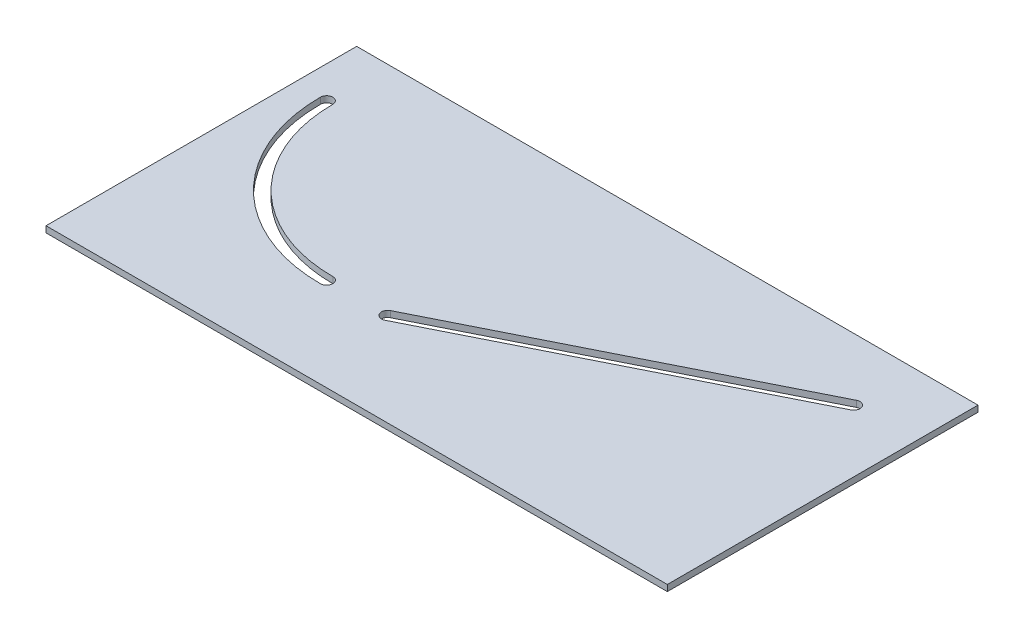
ISO-10303-21;
HEADER;
FILE_DESCRIPTION(('STEP AP214'),'2;1');
FILE_NAME('part.step','',(''),(''),'','','');
FILE_SCHEMA(('AUTOMOTIVE_DESIGN { 1 0 10303 214 1 1 1 1 }'));
ENDSEC;
DATA;
#1=APPLICATION_CONTEXT('core data for automotive mechanical design processes');
#2=APPLICATION_PROTOCOL_DEFINITION('international standard','automotive_design',2000,#1);
#3=PRODUCT_CONTEXT('',#1,'mechanical');
#4=PRODUCT('Part','Part','',(#3));
#5=PRODUCT_RELATED_PRODUCT_CATEGORY('part','',(#4));
#6=PRODUCT_DEFINITION_FORMATION('','',#4);
#7=PRODUCT_DEFINITION_CONTEXT('part definition',#1,'design');
#8=PRODUCT_DEFINITION('design','',#6,#7);
#9=PRODUCT_DEFINITION_SHAPE('','',#8);
#10=(LENGTH_UNIT() NAMED_UNIT(*) SI_UNIT(.MILLI.,.METRE.));
#11=(NAMED_UNIT(*) PLANE_ANGLE_UNIT() SI_UNIT($,.RADIAN.));
#12=(NAMED_UNIT(*) SI_UNIT($,.STERADIAN.) SOLID_ANGLE_UNIT());
#13=UNCERTAINTY_MEASURE_WITH_UNIT(LENGTH_MEASURE(1.E-05),#10,'distance_accuracy_value','');
#14=(GEOMETRIC_REPRESENTATION_CONTEXT(3) GLOBAL_UNCERTAINTY_ASSIGNED_CONTEXT((#13)) GLOBAL_UNIT_ASSIGNED_CONTEXT((#10,
#11,#12)) REPRESENTATION_CONTEXT('',''));
#15=CARTESIAN_POINT('',(0.,0.,0.));
#16=DIRECTION('',(0.,0.,1.));
#17=DIRECTION('',(1.,0.,0.));
#18=AXIS2_PLACEMENT_3D('',#15,#16,#17);
#19=CARTESIAN_POINT('',(0.,0.,1000.));
#20=DIRECTION('',(1.,0.,0.));
#21=DIRECTION('',(0.,0.,-1.));
#22=AXIS2_PLACEMENT_3D('',#19,#20,#21);
#23=PLANE('',#22);
#24=DIRECTION('',(0.,-1.,0.));
#25=VECTOR('',#24,1.);
#26=CARTESIAN_POINT('',(0.,0.,0.));
#27=LINE('',#26,#25);
#28=CARTESIAN_POINT('',(0.,20.,0.));
#29=VERTEX_POINT('',#28);
#30=CARTESIAN_POINT('',(0.,0.,0.));
#31=VERTEX_POINT('',#30);
#32=EDGE_CURVE('E183',#29,#31,#27,.T.);
#33=ORIENTED_EDGE('',*,*,#32,.T.);
#34=DIRECTION('',(0.,0.,-1.));
#35=VECTOR('',#34,1.);
#36=CARTESIAN_POINT('',(0.,0.,1000.));
#37=LINE('',#36,#35);
#38=CARTESIAN_POINT('',(0.,0.,1000.));
#39=VERTEX_POINT('',#38);
#40=EDGE_CURVE('E11',#39,#31,#37,.T.);
#41=ORIENTED_EDGE('',*,*,#40,.F.);
#42=DIRECTION('',(0.,-1.,0.));
#43=VECTOR('',#42,1.);
#44=CARTESIAN_POINT('',(0.,0.,1000.));
#45=LINE('',#44,#43);
#46=CARTESIAN_POINT('',(0.,20.,1000.));
#47=VERTEX_POINT('',#46);
#48=EDGE_CURVE('E190',#47,#39,#45,.T.);
#49=ORIENTED_EDGE('',*,*,#48,.F.);
#50=DIRECTION('',(0.,0.,-1.));
#51=VECTOR('',#50,1.);
#52=CARTESIAN_POINT('',(0.,20.,1000.));
#53=LINE('',#52,#51);
#54=EDGE_CURVE('E200',#47,#29,#53,.T.);
#55=ORIENTED_EDGE('',*,*,#54,.T.);
#56=EDGE_LOOP('',(#33,#41,#49,#55));
#57=FACE_BOUND('',#56,.T.);
#58=ADVANCED_FACE('F33',(#57),#23,.F.);
#59=CARTESIAN_POINT('',(0.,0.,1000.));
#60=DIRECTION('',(0.,1.,0.));
#61=DIRECTION('',(0.,0.,1.));
#62=AXIS2_PLACEMENT_3D('',#59,#60,#61);
#63=PLANE('',#62);
#64=CARTESIAN_POINT('',(603.245255667749,0.,200.));
#65=DIRECTION('',(0.,-1.,0.));
#66=DIRECTION('',(0.,0.,1.));
#67=AXIS2_PLACEMENT_3D('',#64,#65,#66);
#68=CIRCLE('',#67,480.);
#69=CARTESIAN_POINT('',(603.245255667747,0.,680.));
#70=VERTEX_POINT('',#69);
#71=CARTESIAN_POINT('',(123.245255667749,0.,200.));
#72=VERTEX_POINT('',#71);
#73=EDGE_CURVE('E129',#70,#72,#68,.T.);
#74=ORIENTED_EDGE('',*,*,#73,.T.);
#75=CARTESIAN_POINT('',(103.245255667749,0.,200.));
#76=DIRECTION('',(0.,1.,0.));
#77=DIRECTION('',(0.,0.,1.));
#78=AXIS2_PLACEMENT_3D('',#75,#76,#77);
#79=CIRCLE('',#78,20.);
#80=CARTESIAN_POINT('',(83.2452556677487,0.,200.));
#81=VERTEX_POINT('',#80);
#82=EDGE_CURVE('E123',#72,#81,#79,.T.);
#83=ORIENTED_EDGE('',*,*,#82,.T.);
#84=CARTESIAN_POINT('',(603.245255667749,0.,200.));
#85=DIRECTION('',(0.,1.,0.));
#86=DIRECTION('',(0.,0.,1.));
#87=AXIS2_PLACEMENT_3D('',#84,#85,#86);
#88=CIRCLE('',#87,520.);
#89=CARTESIAN_POINT('',(603.245255667749,0.,720.));
#90=VERTEX_POINT('',#89);
#91=EDGE_CURVE('E132',#81,#90,#88,.T.);
#92=ORIENTED_EDGE('',*,*,#91,.T.);
#93=CARTESIAN_POINT('',(603.245255667747,0.,700.));
#94=DIRECTION('',(0.,1.,0.));
#95=DIRECTION('',(0.,0.,1.));
#96=AXIS2_PLACEMENT_3D('',#93,#94,#95);
#97=CIRCLE('',#96,20.);
#98=EDGE_CURVE('E47',#90,#70,#97,.T.);
#99=ORIENTED_EDGE('',*,*,#98,.T.);
#100=EDGE_LOOP('',(#74,#83,#92,#99));
#101=FACE_BOUND('',#100,.T.);
#102=DIRECTION('',(0.894427190999916,0.,-0.447213595499958));
#103=VECTOR('',#102,1.);
#104=CARTESIAN_POINT('',(1808.94427191,0.,217.888543819998));
#105=LINE('',#104,#103);
#106=CARTESIAN_POINT('',(808.944271909999,0.,717.888543819998));
#107=VERTEX_POINT('',#106);
#108=CARTESIAN_POINT('',(1808.94427191,0.,217.888543819998));
#109=VERTEX_POINT('',#108);
#110=EDGE_CURVE('E168',#107,#109,#105,.T.);
#111=ORIENTED_EDGE('',*,*,#110,.T.);
#112=CARTESIAN_POINT('',(1800.,0.,200.));
#113=DIRECTION('',(0.,1.,0.));
#114=DIRECTION('',(0.,0.,1.));
#115=AXIS2_PLACEMENT_3D('',#112,#113,#114);
#116=CIRCLE('',#115,19.9999999999999);
#117=CARTESIAN_POINT('',(1791.05572809,0.,182.111456180002));
#118=VERTEX_POINT('',#117);
#119=EDGE_CURVE('E158',#109,#118,#116,.T.);
#120=ORIENTED_EDGE('',*,*,#119,.T.);
#121=DIRECTION('',(-0.894427190999916,0.,0.447213595499958));
#122=VECTOR('',#121,1.);
#123=CARTESIAN_POINT('',(1791.05572809,0.,182.111456180002));
#124=LINE('',#123,#122);
#125=CARTESIAN_POINT('',(791.055728090001,0.,682.111456180002));
#126=VERTEX_POINT('',#125);
#127=EDGE_CURVE('E161',#118,#126,#124,.T.);
#128=ORIENTED_EDGE('',*,*,#127,.T.);
#129=CARTESIAN_POINT('',(800.,0.,700.));
#130=DIRECTION('',(0.,1.,0.));
#131=DIRECTION('',(0.,0.,1.));
#132=AXIS2_PLACEMENT_3D('',#129,#130,#131);
#133=CIRCLE('',#132,20.);
#134=EDGE_CURVE('E165',#126,#107,#133,.T.);
#135=ORIENTED_EDGE('',*,*,#134,.T.);
#136=EDGE_LOOP('',(#111,#120,#128,#135));
#137=FACE_BOUND('',#136,.T.);
#138=DIRECTION('',(1.,0.,0.));
#139=VECTOR('',#138,1.);
#140=CARTESIAN_POINT('',(0.,0.,0.));
#141=LINE('',#140,#139);
#142=CARTESIAN_POINT('',(2000.,0.,0.));
#143=VERTEX_POINT('',#142);
#144=EDGE_CURVE('E203',#31,#143,#141,.T.);
#145=ORIENTED_EDGE('',*,*,#144,.T.);
#146=DIRECTION('',(0.,0.,-1.));
#147=VECTOR('',#146,1.);
#148=CARTESIAN_POINT('',(2000.,0.,1000.));
#149=LINE('',#148,#147);
#150=CARTESIAN_POINT('',(2000.,0.,1000.));
#151=VERTEX_POINT('',#150);
#152=EDGE_CURVE('E40',#151,#143,#149,.T.);
#153=ORIENTED_EDGE('',*,*,#152,.F.);
#154=DIRECTION('',(1.,0.,0.));
#155=VECTOR('',#154,1.);
#156=CARTESIAN_POINT('',(0.,0.,1000.));
#157=LINE('',#156,#155);
#158=EDGE_CURVE('E193',#39,#151,#157,.T.);
#159=ORIENTED_EDGE('',*,*,#158,.F.);
#160=ORIENTED_EDGE('',*,*,#40,.T.);
#161=EDGE_LOOP('',(#145,#153,#159,#160));
#162=FACE_BOUND('',#161,.T.);
#163=ADVANCED_FACE('F136',(#101,#137,#162),#63,.F.);
#164=CARTESIAN_POINT('',(2000.,0.,1000.));
#165=DIRECTION('',(-1.,0.,0.));
#166=DIRECTION('',(0.,0.,1.));
#167=AXIS2_PLACEMENT_3D('',#164,#165,#166);
#168=PLANE('',#167);
#169=DIRECTION('',(0.,1.,0.));
#170=VECTOR('',#169,1.);
#171=CARTESIAN_POINT('',(2000.,0.,0.));
#172=LINE('',#171,#170);
#173=CARTESIAN_POINT('',(2000.,20.,0.));
#174=VERTEX_POINT('',#173);
#175=EDGE_CURVE('E205',#143,#174,#172,.T.);
#176=ORIENTED_EDGE('',*,*,#175,.T.);
#177=DIRECTION('',(0.,0.,-1.));
#178=VECTOR('',#177,1.);
#179=CARTESIAN_POINT('',(2000.,20.,1000.));
#180=LINE('',#179,#178);
#181=CARTESIAN_POINT('',(2000.,20.,1000.));
#182=VERTEX_POINT('',#181);
#183=EDGE_CURVE('E210',#182,#174,#180,.T.);
#184=ORIENTED_EDGE('',*,*,#183,.F.);
#185=DIRECTION('',(0.,1.,0.));
#186=VECTOR('',#185,1.);
#187=CARTESIAN_POINT('',(2000.,0.,1000.));
#188=LINE('',#187,#186);
#189=EDGE_CURVE('E196',#151,#182,#188,.T.);
#190=ORIENTED_EDGE('',*,*,#189,.F.);
#191=ORIENTED_EDGE('',*,*,#152,.T.);
#192=EDGE_LOOP('',(#176,#184,#190,#191));
#193=FACE_BOUND('',#192,.T.);
#194=ADVANCED_FACE('F217',(#193),#168,.F.);
#195=CARTESIAN_POINT('',(0.,20.,1000.));
#196=DIRECTION('',(0.,-1.,0.));
#197=DIRECTION('',(0.,0.,-1.));
#198=AXIS2_PLACEMENT_3D('',#195,#196,#197);
#199=PLANE('',#198);
#200=CARTESIAN_POINT('',(603.245255667749,20.,200.));
#201=DIRECTION('',(0.,1.,0.));
#202=DIRECTION('',(0.,0.,1.));
#203=AXIS2_PLACEMENT_3D('',#200,#201,#202);
#204=CIRCLE('',#203,520.);
#205=CARTESIAN_POINT('',(83.2452556677487,20.,200.));
#206=VERTEX_POINT('',#205);
#207=CARTESIAN_POINT('',(603.245255667747,20.,720.));
#208=VERTEX_POINT('',#207);
#209=EDGE_CURVE('E148',#206,#208,#204,.T.);
#210=ORIENTED_EDGE('',*,*,#209,.F.);
#211=CARTESIAN_POINT('',(103.245255667749,20.,200.));
#212=DIRECTION('',(0.,1.,0.));
#213=DIRECTION('',(0.,0.,1.));
#214=AXIS2_PLACEMENT_3D('',#211,#212,#213);
#215=CIRCLE('',#214,20.);
#216=CARTESIAN_POINT('',(123.245255667749,20.,200.));
#217=VERTEX_POINT('',#216);
#218=EDGE_CURVE('E55',#217,#206,#215,.T.);
#219=ORIENTED_EDGE('',*,*,#218,.F.);
#220=CARTESIAN_POINT('',(603.245255667749,20.,200.));
#221=DIRECTION('',(0.,-1.,0.));
#222=DIRECTION('',(0.,0.,1.));
#223=AXIS2_PLACEMENT_3D('',#220,#221,#222);
#224=CIRCLE('',#223,480.);
#225=CARTESIAN_POINT('',(603.245255667747,20.,680.));
#226=VERTEX_POINT('',#225);
#227=EDGE_CURVE('E139',#226,#217,#224,.T.);
#228=ORIENTED_EDGE('',*,*,#227,.F.);
#229=CARTESIAN_POINT('',(603.245255667747,20.,700.));
#230=DIRECTION('',(0.,1.,0.));
#231=DIRECTION('',(0.,0.,1.));
#232=AXIS2_PLACEMENT_3D('',#229,#230,#231);
#233=CIRCLE('',#232,20.);
#234=EDGE_CURVE('E142',#208,#226,#233,.T.);
#235=ORIENTED_EDGE('',*,*,#234,.F.);
#236=EDGE_LOOP('',(#210,#219,#228,#235));
#237=FACE_BOUND('',#236,.T.);
#238=DIRECTION('',(-0.894427190999916,0.,0.447213595499958));
#239=VECTOR('',#238,1.);
#240=CARTESIAN_POINT('',(1791.05572809,20.,182.111456180002));
#241=LINE('',#240,#239);
#242=CARTESIAN_POINT('',(1791.05572809,20.,182.111456180002));
#243=VERTEX_POINT('',#242);
#244=CARTESIAN_POINT('',(791.055728090001,20.,682.111456180002));
#245=VERTEX_POINT('',#244);
#246=EDGE_CURVE('E173',#243,#245,#241,.T.);
#247=ORIENTED_EDGE('',*,*,#246,.F.);
#248=CARTESIAN_POINT('',(1800.,20.,200.));
#249=DIRECTION('',(0.,1.,0.));
#250=DIRECTION('',(0.,0.,1.));
#251=AXIS2_PLACEMENT_3D('',#248,#249,#250);
#252=CIRCLE('',#251,19.9999999999999);
#253=CARTESIAN_POINT('',(1808.94427191,20.,217.888543819998));
#254=VERTEX_POINT('',#253);
#255=EDGE_CURVE('E154',#254,#243,#252,.T.);
#256=ORIENTED_EDGE('',*,*,#255,.F.);
#257=DIRECTION('',(0.894427190999916,0.,-0.447213595499958));
#258=VECTOR('',#257,1.);
#259=CARTESIAN_POINT('',(1808.94427191,20.,217.888543819998));
#260=LINE('',#259,#258);
#261=CARTESIAN_POINT('',(808.944271909999,20.,717.888543819998));
#262=VERTEX_POINT('',#261);
#263=EDGE_CURVE('E162',#262,#254,#260,.T.);
#264=ORIENTED_EDGE('',*,*,#263,.F.);
#265=CARTESIAN_POINT('',(800.,20.,700.));
#266=DIRECTION('',(0.,1.,0.));
#267=DIRECTION('',(0.,0.,1.));
#268=AXIS2_PLACEMENT_3D('',#265,#266,#267);
#269=CIRCLE('',#268,20.);
#270=EDGE_CURVE('E176',#245,#262,#269,.T.);
#271=ORIENTED_EDGE('',*,*,#270,.F.);
#272=EDGE_LOOP('',(#247,#256,#264,#271));
#273=FACE_BOUND('',#272,.T.);
#274=DIRECTION('',(-1.,0.,0.));
#275=VECTOR('',#274,1.);
#276=CARTESIAN_POINT('',(0.,20.,0.));
#277=LINE('',#276,#275);
#278=EDGE_CURVE('E194',#174,#29,#277,.T.);
#279=ORIENTED_EDGE('',*,*,#278,.T.);
#280=ORIENTED_EDGE('',*,*,#54,.F.);
#281=DIRECTION('',(-1.,0.,0.));
#282=VECTOR('',#281,1.);
#283=CARTESIAN_POINT('',(0.,20.,1000.));
#284=LINE('',#283,#282);
#285=EDGE_CURVE('E198',#182,#47,#284,.T.);
#286=ORIENTED_EDGE('',*,*,#285,.F.);
#287=ORIENTED_EDGE('',*,*,#183,.T.);
#288=EDGE_LOOP('',(#279,#280,#286,#287));
#289=FACE_BOUND('',#288,.T.);
#290=ADVANCED_FACE('F226',(#237,#273,#289),#199,.F.);
#291=CARTESIAN_POINT('',(0.,0.,1000.));
#292=DIRECTION('',(0.,0.,-1.));
#293=DIRECTION('',(-1.,0.,0.));
#294=AXIS2_PLACEMENT_3D('',#291,#292,#293);
#295=PLANE('',#294);
#296=ORIENTED_EDGE('',*,*,#48,.T.);
#297=ORIENTED_EDGE('',*,*,#158,.T.);
#298=ORIENTED_EDGE('',*,*,#189,.T.);
#299=ORIENTED_EDGE('',*,*,#285,.T.);
#300=EDGE_LOOP('',(#296,#297,#298,#299));
#301=FACE_BOUND('',#300,.T.);
#302=ADVANCED_FACE('F232',(#301),#295,.F.);
#303=CARTESIAN_POINT('',(0.,0.,0.));
#304=DIRECTION('',(0.,0.,-1.));
#305=DIRECTION('',(-1.,0.,0.));
#306=AXIS2_PLACEMENT_3D('',#303,#304,#305);
#307=PLANE('',#306);
#308=ORIENTED_EDGE('',*,*,#32,.F.);
#309=ORIENTED_EDGE('',*,*,#278,.F.);
#310=ORIENTED_EDGE('',*,*,#175,.F.);
#311=ORIENTED_EDGE('',*,*,#144,.F.);
#312=EDGE_LOOP('',(#308,#309,#310,#311));
#313=FACE_BOUND('',#312,.T.);
#314=ADVANCED_FACE('F223',(#313),#307,.T.);
#315=CARTESIAN_POINT('',(1800.,0.,200.));
#316=DIRECTION('',(0.,1.,0.));
#317=DIRECTION('',(0.,0.,1.));
#318=AXIS2_PLACEMENT_3D('',#315,#316,#317);
#319=CYLINDRICAL_SURFACE('',#318,19.9999999999999);
#320=ORIENTED_EDGE('',*,*,#255,.T.);
#321=DIRECTION('',(0.,1.,0.));
#322=VECTOR('',#321,1.);
#323=CARTESIAN_POINT('',(1791.05572809,0.,182.111456180002));
#324=LINE('',#323,#322);
#325=EDGE_CURVE('E171',#118,#243,#324,.T.);
#326=ORIENTED_EDGE('',*,*,#325,.F.);
#327=ORIENTED_EDGE('',*,*,#119,.F.);
#328=DIRECTION('',(0.,1.,0.));
#329=VECTOR('',#328,1.);
#330=CARTESIAN_POINT('',(1808.94427191,0.,217.888543819998));
#331=LINE('',#330,#329);
#332=EDGE_CURVE('E181',#109,#254,#331,.T.);
#333=ORIENTED_EDGE('',*,*,#332,.T.);
#334=EDGE_LOOP('',(#320,#326,#327,#333));
#335=FACE_BOUND('',#334,.T.);
#336=ADVANCED_FACE('F246',(#335),#319,.F.);
#337=CARTESIAN_POINT('',(1808.94427191,0.,217.888543819998));
#338=DIRECTION('',(0.447213595499958,0.,0.894427190999916));
#339=DIRECTION('',(0.894427190999916,0.,-0.447213595499958));
#340=AXIS2_PLACEMENT_3D('',#337,#338,#339);
#341=PLANE('',#340);
#342=ORIENTED_EDGE('',*,*,#263,.T.);
#343=ORIENTED_EDGE('',*,*,#332,.F.);
#344=ORIENTED_EDGE('',*,*,#110,.F.);
#345=DIRECTION('',(0.,1.,0.));
#346=VECTOR('',#345,1.);
#347=CARTESIAN_POINT('',(808.944271909999,0.,717.888543819998));
#348=LINE('',#347,#346);
#349=EDGE_CURVE('E184',#107,#262,#348,.T.);
#350=ORIENTED_EDGE('',*,*,#349,.T.);
#351=EDGE_LOOP('',(#342,#343,#344,#350));
#352=FACE_BOUND('',#351,.T.);
#353=ADVANCED_FACE('F251',(#352),#341,.F.);
#354=CARTESIAN_POINT('',(800.,0.,700.));
#355=DIRECTION('',(0.,1.,0.));
#356=DIRECTION('',(0.,0.,1.));
#357=AXIS2_PLACEMENT_3D('',#354,#355,#356);
#358=CYLINDRICAL_SURFACE('',#357,20.);
#359=ORIENTED_EDGE('',*,*,#270,.T.);
#360=ORIENTED_EDGE('',*,*,#349,.F.);
#361=ORIENTED_EDGE('',*,*,#134,.F.);
#362=DIRECTION('',(0.,1.,0.));
#363=VECTOR('',#362,1.);
#364=CARTESIAN_POINT('',(791.055728090001,0.,682.111456180002));
#365=LINE('',#364,#363);
#366=EDGE_CURVE('E186',#126,#245,#365,.T.);
#367=ORIENTED_EDGE('',*,*,#366,.T.);
#368=EDGE_LOOP('',(#359,#360,#361,#367));
#369=FACE_BOUND('',#368,.T.);
#370=ADVANCED_FACE('F256',(#369),#358,.F.);
#371=CARTESIAN_POINT('',(1791.05572809,0.,182.111456180002));
#372=DIRECTION('',(-0.447213595499958,0.,-0.894427190999916));
#373=DIRECTION('',(-0.894427190999916,0.,0.447213595499958));
#374=AXIS2_PLACEMENT_3D('',#371,#372,#373);
#375=PLANE('',#374);
#376=ORIENTED_EDGE('',*,*,#246,.T.);
#377=ORIENTED_EDGE('',*,*,#366,.F.);
#378=ORIENTED_EDGE('',*,*,#127,.F.);
#379=ORIENTED_EDGE('',*,*,#325,.T.);
#380=EDGE_LOOP('',(#376,#377,#378,#379));
#381=FACE_BOUND('',#380,.T.);
#382=ADVANCED_FACE('F253',(#381),#375,.F.);
#383=CARTESIAN_POINT('',(103.245255667749,0.,200.));
#384=DIRECTION('',(0.,1.,0.));
#385=DIRECTION('',(0.,0.,1.));
#386=AXIS2_PLACEMENT_3D('',#383,#384,#385);
#387=CYLINDRICAL_SURFACE('',#386,20.);
#388=ORIENTED_EDGE('',*,*,#218,.T.);
#389=DIRECTION('',(0.,1.,0.));
#390=VECTOR('',#389,1.);
#391=CARTESIAN_POINT('',(83.2452556677487,0.,200.));
#392=LINE('',#391,#390);
#393=EDGE_CURVE('E119',#81,#206,#392,.T.);
#394=ORIENTED_EDGE('',*,*,#393,.F.);
#395=ORIENTED_EDGE('',*,*,#82,.F.);
#396=DIRECTION('',(0.,1.,0.));
#397=VECTOR('',#396,1.);
#398=CARTESIAN_POINT('',(123.245255667749,0.,200.));
#399=LINE('',#398,#397);
#400=EDGE_CURVE('E152',#72,#217,#399,.T.);
#401=ORIENTED_EDGE('',*,*,#400,.T.);
#402=EDGE_LOOP('',(#388,#394,#395,#401));
#403=FACE_BOUND('',#402,.T.);
#404=ADVANCED_FACE('F121',(#403),#387,.F.);
#405=CARTESIAN_POINT('',(603.245255667749,0.,200.));
#406=DIRECTION('',(0.,1.,0.));
#407=DIRECTION('',(0.,0.,1.));
#408=AXIS2_PLACEMENT_3D('',#405,#406,#407);
#409=CYLINDRICAL_SURFACE('',#408,480.);
#410=ORIENTED_EDGE('',*,*,#227,.T.);
#411=ORIENTED_EDGE('',*,*,#400,.F.);
#412=ORIENTED_EDGE('',*,*,#73,.F.);
#413=DIRECTION('',(0.,1.,0.));
#414=VECTOR('',#413,1.);
#415=CARTESIAN_POINT('',(603.245255667747,0.,680.));
#416=LINE('',#415,#414);
#417=EDGE_CURVE('E155',#70,#226,#416,.T.);
#418=ORIENTED_EDGE('',*,*,#417,.T.);
#419=EDGE_LOOP('',(#410,#411,#412,#418));
#420=FACE_BOUND('',#419,.T.);
#421=ADVANCED_FACE('F266',(#420),#409,.T.);
#422=CARTESIAN_POINT('',(603.245255667747,0.,700.));
#423=DIRECTION('',(0.,1.,0.));
#424=DIRECTION('',(0.,0.,1.));
#425=AXIS2_PLACEMENT_3D('',#422,#423,#424);
#426=CYLINDRICAL_SURFACE('',#425,20.);
#427=ORIENTED_EDGE('',*,*,#234,.T.);
#428=ORIENTED_EDGE('',*,*,#417,.F.);
#429=ORIENTED_EDGE('',*,*,#98,.F.);
#430=DIRECTION('',(0.,1.,0.));
#431=VECTOR('',#430,1.);
#432=CARTESIAN_POINT('',(603.245255667747,0.,720.));
#433=LINE('',#432,#431);
#434=EDGE_CURVE('E128',#90,#208,#433,.T.);
#435=ORIENTED_EDGE('',*,*,#434,.T.);
#436=EDGE_LOOP('',(#427,#428,#429,#435));
#437=FACE_BOUND('',#436,.T.);
#438=ADVANCED_FACE('F269',(#437),#426,.F.);
#439=CARTESIAN_POINT('',(603.245255667749,0.,200.));
#440=DIRECTION('',(0.,1.,0.));
#441=DIRECTION('',(0.,0.,1.));
#442=AXIS2_PLACEMENT_3D('',#439,#440,#441);
#443=CYLINDRICAL_SURFACE('',#442,520.);
#444=ORIENTED_EDGE('',*,*,#209,.T.);
#445=ORIENTED_EDGE('',*,*,#434,.F.);
#446=ORIENTED_EDGE('',*,*,#91,.F.);
#447=ORIENTED_EDGE('',*,*,#393,.T.);
#448=EDGE_LOOP('',(#444,#445,#446,#447));
#449=FACE_BOUND('',#448,.T.);
#450=ADVANCED_FACE('F133',(#449),#443,.F.);
#451=CLOSED_SHELL('',(#58,#163,#194,#290,#302,#314,#336,#353,#370,#382,#404,#421,#438,#450));
#452=MANIFOLD_SOLID_BREP('B2',#451);
#453=ADVANCED_BREP_SHAPE_REPRESENTATION('',(#18,#452),#14);
#454=SHAPE_DEFINITION_REPRESENTATION(#9,#453);
ENDSEC;
END-ISO-10303-21;
